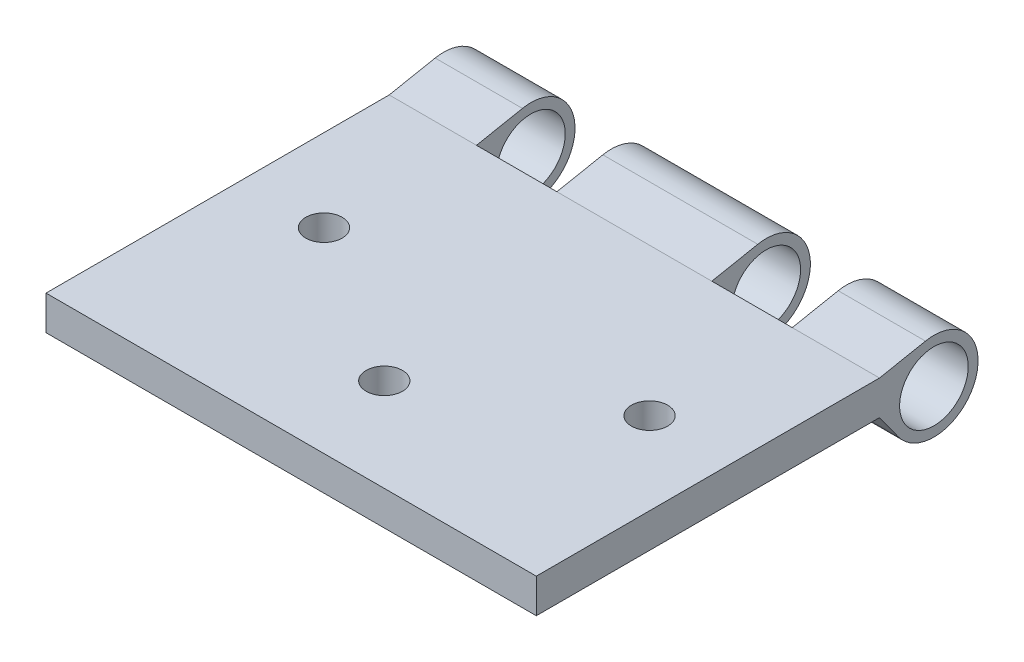
ISO-10303-21;
HEADER;
FILE_DESCRIPTION(('STEP AP214'),'2;1');
FILE_NAME('part.step','',(''),(''),'','','');
FILE_SCHEMA(('AUTOMOTIVE_DESIGN { 1 0 10303 214 1 1 1 1 }'));
ENDSEC;
DATA;
#1=APPLICATION_CONTEXT('core data for automotive mechanical design processes');
#2=APPLICATION_PROTOCOL_DEFINITION('international standard','automotive_design',2000,#1);
#3=PRODUCT_CONTEXT('',#1,'mechanical');
#4=PRODUCT('Part','Part','',(#3));
#5=PRODUCT_RELATED_PRODUCT_CATEGORY('part','',(#4));
#6=PRODUCT_DEFINITION_FORMATION('','',#4);
#7=PRODUCT_DEFINITION_CONTEXT('part definition',#1,'design');
#8=PRODUCT_DEFINITION('design','',#6,#7);
#9=PRODUCT_DEFINITION_SHAPE('','',#8);
#10=(LENGTH_UNIT() NAMED_UNIT(*) SI_UNIT(.MILLI.,.METRE.));
#11=(NAMED_UNIT(*) PLANE_ANGLE_UNIT() SI_UNIT($,.RADIAN.));
#12=(NAMED_UNIT(*) SI_UNIT($,.STERADIAN.) SOLID_ANGLE_UNIT());
#13=UNCERTAINTY_MEASURE_WITH_UNIT(LENGTH_MEASURE(1.E-05),#10,'distance_accuracy_value','');
#14=(GEOMETRIC_REPRESENTATION_CONTEXT(3) GLOBAL_UNCERTAINTY_ASSIGNED_CONTEXT((#13)) GLOBAL_UNIT_ASSIGNED_CONTEXT((#10,
#11,#12)) REPRESENTATION_CONTEXT('',''));
#15=CARTESIAN_POINT('',(0.,0.,0.));
#16=DIRECTION('',(0.,0.,1.));
#17=DIRECTION('',(1.,0.,0.));
#18=AXIS2_PLACEMENT_3D('',#15,#16,#17);
#19=CARTESIAN_POINT('',(25.,0.,-17.5));
#20=DIRECTION('',(0.,0.585308319667777,-0.810810810810811));
#21=DIRECTION('',(0.,0.810810810810811,0.585308319667777));
#22=AXIS2_PLACEMENT_3D('',#19,#20,#21);
#23=PLANE('',#22);
#24=DIRECTION('',(0.,-0.810810810810811,-0.585308319667777));
#25=VECTOR('',#24,1.);
#26=CARTESIAN_POINT('',(-7.9,0.,-17.5));
#27=LINE('',#26,#25);
#28=CARTESIAN_POINT('',(-7.9,0.,-17.5));
#29=VERTEX_POINT('',#28);
#30=CARTESIAN_POINT('',(-7.9,-2.63388743850499,-19.4013513513514));
#31=VERTEX_POINT('',#30);
#32=EDGE_CURVE('E304',#29,#31,#27,.T.);
#33=ORIENTED_EDGE('',*,*,#32,.T.);
#34=DIRECTION('',(-1.,0.,0.));
#35=VECTOR('',#34,1.);
#36=CARTESIAN_POINT('',(25.,-2.63388743850499,-19.4013513513514));
#37=LINE('',#36,#35);
#38=CARTESIAN_POINT('',(7.9,-2.63388743850499,-19.4013513513514));
#39=VERTEX_POINT('',#38);
#40=EDGE_CURVE('E181',#39,#31,#37,.T.);
#41=ORIENTED_EDGE('',*,*,#40,.F.);
#42=DIRECTION('',(0.,-0.810810810810811,-0.585308319667777));
#43=VECTOR('',#42,1.);
#44=CARTESIAN_POINT('',(7.9,0.,-17.5));
#45=LINE('',#44,#43);
#46=CARTESIAN_POINT('',(7.9,0.,-17.5));
#47=VERTEX_POINT('',#46);
#48=EDGE_CURVE('E264',#47,#39,#45,.T.);
#49=ORIENTED_EDGE('',*,*,#48,.F.);
#50=DIRECTION('',(-1.,0.,0.));
#51=VECTOR('',#50,1.);
#52=CARTESIAN_POINT('',(-25.,0.,-17.5));
#53=LINE('',#52,#51);
#54=EDGE_CURVE('E221',#47,#29,#53,.T.);
#55=ORIENTED_EDGE('',*,*,#54,.T.);
#56=EDGE_LOOP('',(#33,#41,#49,#55));
#57=FACE_BOUND('',#56,.T.);
#58=ADVANCED_FACE('F37',(#57),#23,.F.);
#59=CARTESIAN_POINT('',(25.,0.,-23.05));
#60=DIRECTION('',(-1.,0.,0.));
#61=DIRECTION('',(0.,0.,1.));
#62=AXIS2_PLACEMENT_3D('',#59,#60,#61);
#63=CYLINDRICAL_SURFACE('',#62,4.5);
#64=CARTESIAN_POINT('',(-7.9,0.,-23.05));
#65=DIRECTION('',(1.,0.,0.));
#66=DIRECTION('',(0.,0.,-1.));
#67=AXIS2_PLACEMENT_3D('',#64,#65,#66);
#68=CIRCLE('',#67,4.5);
#69=CARTESIAN_POINT('',(-7.9,4.41636440085435,-22.1864460185568));
#70=VERTEX_POINT('',#69);
#71=EDGE_CURVE('E302',#31,#70,#68,.T.);
#72=ORIENTED_EDGE('',*,*,#71,.T.);
#73=DIRECTION('',(-1.,0.,0.));
#74=VECTOR('',#73,1.);
#75=CARTESIAN_POINT('',(25.,4.41636440085435,-22.1864460185568));
#76=LINE('',#75,#74);
#77=CARTESIAN_POINT('',(7.9,4.41636440085435,-22.1864460185568));
#78=VERTEX_POINT('',#77);
#79=EDGE_CURVE('E165',#78,#70,#76,.T.);
#80=ORIENTED_EDGE('',*,*,#79,.F.);
#81=CARTESIAN_POINT('',(7.9,0.,-23.05));
#82=DIRECTION('',(1.,0.,0.));
#83=DIRECTION('',(0.,0.,-1.));
#84=AXIS2_PLACEMENT_3D('',#81,#82,#83);
#85=CIRCLE('',#84,4.5);
#86=EDGE_CURVE('E62',#39,#78,#85,.T.);
#87=ORIENTED_EDGE('',*,*,#86,.F.);
#88=ORIENTED_EDGE('',*,*,#40,.T.);
#89=EDGE_LOOP('',(#72,#80,#87,#88));
#90=FACE_BOUND('',#89,.T.);
#91=ADVANCED_FACE('F314',(#90),#63,.T.);
#92=CARTESIAN_POINT('',(25.,3.5,-17.5));
#93=DIRECTION('',(0.,-0.981414311300966,-0.191900884765156));
#94=DIRECTION('',(0.,0.191900884765156,-0.981414311300967));
#95=AXIS2_PLACEMENT_3D('',#92,#93,#94);
#96=PLANE('',#95);
#97=DIRECTION('',(0.,-0.191900884765156,0.981414311300966));
#98=VECTOR('',#97,1.);
#99=CARTESIAN_POINT('',(-7.9,3.5,-17.5));
#100=LINE('',#99,#98);
#101=CARTESIAN_POINT('',(-7.9,3.5,-17.5));
#102=VERTEX_POINT('',#101);
#103=EDGE_CURVE('E299',#70,#102,#100,.T.);
#104=ORIENTED_EDGE('',*,*,#103,.T.);
#105=DIRECTION('',(-1.,0.,0.));
#106=VECTOR('',#105,1.);
#107=CARTESIAN_POINT('',(-25.,3.5,-17.5));
#108=LINE('',#107,#106);
#109=CARTESIAN_POINT('',(7.9,3.5,-17.5));
#110=VERTEX_POINT('',#109);
#111=EDGE_CURVE('E209',#110,#102,#108,.T.);
#112=ORIENTED_EDGE('',*,*,#111,.F.);
#113=DIRECTION('',(0.,-0.191900884765156,0.981414311300966));
#114=VECTOR('',#113,1.);
#115=CARTESIAN_POINT('',(7.9,3.5,-17.5));
#116=LINE('',#115,#114);
#117=EDGE_CURVE('E239',#78,#110,#116,.T.);
#118=ORIENTED_EDGE('',*,*,#117,.F.);
#119=ORIENTED_EDGE('',*,*,#79,.T.);
#120=EDGE_LOOP('',(#104,#112,#118,#119));
#121=FACE_BOUND('',#120,.T.);
#122=ADVANCED_FACE('F297',(#121),#96,.F.);
#123=CARTESIAN_POINT('',(25.,0.,-23.05));
#124=DIRECTION('',(-1.,0.,0.));
#125=DIRECTION('',(0.,0.,1.));
#126=AXIS2_PLACEMENT_3D('',#123,#124,#125);
#127=CYLINDRICAL_SURFACE('',#126,3.5);
#128=CARTESIAN_POINT('',(7.9,0.,-23.05));
#129=DIRECTION('',(1.,0.,0.));
#130=DIRECTION('',(0.,0.,-1.));
#131=AXIS2_PLACEMENT_3D('',#128,#129,#130);
#132=CIRCLE('',#131,3.5);
#133=CARTESIAN_POINT('',(7.9,0.,-26.55));
#134=VERTEX_POINT('',#133);
#135=EDGE_CURVE('E226',#134,#134,#132,.T.);
#136=ORIENTED_EDGE('',*,*,#135,.T.);
#137=EDGE_LOOP('',(#136));
#138=FACE_BOUND('',#137,.T.);
#139=CARTESIAN_POINT('',(-7.9,0.,-23.05));
#140=DIRECTION('',(-1.,0.,0.));
#141=DIRECTION('',(0.,0.,1.));
#142=AXIS2_PLACEMENT_3D('',#139,#140,#141);
#143=CIRCLE('',#142,3.5);
#144=CARTESIAN_POINT('',(-7.9,0.,-19.55));
#145=VERTEX_POINT('',#144);
#146=EDGE_CURVE('E233',#145,#145,#143,.T.);
#147=ORIENTED_EDGE('',*,*,#146,.T.);
#148=EDGE_LOOP('',(#147));
#149=FACE_BOUND('',#148,.T.);
#150=ADVANCED_FACE('F337',(#138,#149),#127,.F.);
#151=CARTESIAN_POINT('',(-16.1,-2.63388743850499,-19.4013513513514));
#152=VERTEX_POINT('',#151);
#153=CARTESIAN_POINT('',(-25.,-2.63388743850499,-19.4013513513514));
#154=VERTEX_POINT('',#153);
#155=EDGE_CURVE('E176',#152,#154,#37,.T.);
#156=ORIENTED_EDGE('',*,*,#155,.F.);
#157=DIRECTION('',(0.,-0.810810810810811,-0.585308319667777));
#158=VECTOR('',#157,1.);
#159=CARTESIAN_POINT('',(-16.1,0.,-17.5));
#160=LINE('',#159,#158);
#161=CARTESIAN_POINT('',(-16.1,0.,-17.5));
#162=VERTEX_POINT('',#161);
#163=EDGE_CURVE('E147',#162,#152,#160,.T.);
#164=ORIENTED_EDGE('',*,*,#163,.F.);
#165=CARTESIAN_POINT('',(-25.,0.,-17.5));
#166=VERTEX_POINT('',#165);
#167=EDGE_CURVE('E215',#162,#166,#53,.T.);
#168=ORIENTED_EDGE('',*,*,#167,.T.);
#169=DIRECTION('',(0.,-0.810810810810811,-0.585308319667777));
#170=VECTOR('',#169,1.);
#171=CARTESIAN_POINT('',(-25.,0.,-17.5));
#172=LINE('',#171,#170);
#173=EDGE_CURVE('E274',#166,#154,#172,.T.);
#174=ORIENTED_EDGE('',*,*,#173,.T.);
#175=EDGE_LOOP('',(#156,#164,#168,#174));
#176=FACE_BOUND('',#175,.T.);
#177=ADVANCED_FACE('F328',(#176),#23,.F.);
#178=CARTESIAN_POINT('',(-16.1,4.41636440085435,-22.1864460185568));
#179=VERTEX_POINT('',#178);
#180=CARTESIAN_POINT('',(-25.,4.41636440085435,-22.1864460185568));
#181=VERTEX_POINT('',#180);
#182=EDGE_CURVE('E156',#179,#181,#76,.T.);
#183=ORIENTED_EDGE('',*,*,#182,.F.);
#184=CARTESIAN_POINT('',(-16.1,0.,-23.05));
#185=DIRECTION('',(1.,0.,0.));
#186=DIRECTION('',(0.,0.,-1.));
#187=AXIS2_PLACEMENT_3D('',#184,#185,#186);
#188=CIRCLE('',#187,4.5);
#189=EDGE_CURVE('E140',#152,#179,#188,.T.);
#190=ORIENTED_EDGE('',*,*,#189,.F.);
#191=ORIENTED_EDGE('',*,*,#155,.T.);
#192=CARTESIAN_POINT('',(-25.,0.,-23.05));
#193=DIRECTION('',(1.,0.,0.));
#194=DIRECTION('',(0.,0.,-1.));
#195=AXIS2_PLACEMENT_3D('',#192,#193,#194);
#196=CIRCLE('',#195,4.5);
#197=EDGE_CURVE('E163',#154,#181,#196,.T.);
#198=ORIENTED_EDGE('',*,*,#197,.T.);
#199=EDGE_LOOP('',(#183,#190,#191,#198));
#200=FACE_BOUND('',#199,.T.);
#201=ADVANCED_FACE('F161',(#200),#63,.T.);
#202=CARTESIAN_POINT('',(-16.1,3.5,-17.5));
#203=VERTEX_POINT('',#202);
#204=CARTESIAN_POINT('',(-25.,3.5,-17.5));
#205=VERTEX_POINT('',#204);
#206=EDGE_CURVE('E158',#203,#205,#108,.T.);
#207=ORIENTED_EDGE('',*,*,#206,.F.);
#208=DIRECTION('',(0.,-0.191900884765156,0.981414311300966));
#209=VECTOR('',#208,1.);
#210=CARTESIAN_POINT('',(-16.1,3.5,-17.5));
#211=LINE('',#210,#209);
#212=EDGE_CURVE('E144',#179,#203,#211,.T.);
#213=ORIENTED_EDGE('',*,*,#212,.F.);
#214=ORIENTED_EDGE('',*,*,#182,.T.);
#215=DIRECTION('',(0.,-0.191900884765156,0.981414311300966));
#216=VECTOR('',#215,1.);
#217=CARTESIAN_POINT('',(-25.,3.5,-17.5));
#218=LINE('',#217,#216);
#219=EDGE_CURVE('E279',#181,#205,#218,.T.);
#220=ORIENTED_EDGE('',*,*,#219,.T.);
#221=EDGE_LOOP('',(#207,#213,#214,#220));
#222=FACE_BOUND('',#221,.T.);
#223=ADVANCED_FACE('F154',(#222),#96,.F.);
#224=CARTESIAN_POINT('',(-16.1,0.,-23.05));
#225=DIRECTION('',(-1.,0.,0.));
#226=DIRECTION('',(0.,0.,1.));
#227=AXIS2_PLACEMENT_3D('',#224,#225,#226);
#228=CIRCLE('',#227,3.5);
#229=CARTESIAN_POINT('',(-16.1,0.,-19.55));
#230=VERTEX_POINT('',#229);
#231=EDGE_CURVE('E41',#230,#230,#228,.T.);
#232=ORIENTED_EDGE('',*,*,#231,.F.);
#233=EDGE_LOOP('',(#232));
#234=FACE_BOUND('',#233,.T.);
#235=CARTESIAN_POINT('',(-25.,0.,-23.05));
#236=DIRECTION('',(1.,0.,0.));
#237=DIRECTION('',(0.,0.,-1.));
#238=AXIS2_PLACEMENT_3D('',#235,#236,#237);
#239=CIRCLE('',#238,3.5);
#240=CARTESIAN_POINT('',(-25.,0.,-26.55));
#241=VERTEX_POINT('',#240);
#242=EDGE_CURVE('E232',#241,#241,#239,.T.);
#243=ORIENTED_EDGE('',*,*,#242,.F.);
#244=EDGE_LOOP('',(#243));
#245=FACE_BOUND('',#244,.T.);
#246=ADVANCED_FACE('F377',(#234,#245),#127,.F.);
#247=CARTESIAN_POINT('',(25.,3.5,-17.5));
#248=DIRECTION('',(-1.,0.,0.));
#249=DIRECTION('',(0.,0.,1.));
#250=AXIS2_PLACEMENT_3D('',#247,#248,#249);
#251=PLANE('',#250);
#252=DIRECTION('',(0.,0.,-1.));
#253=VECTOR('',#252,1.);
#254=CARTESIAN_POINT('',(25.,0.,-17.5));
#255=LINE('',#254,#253);
#256=CARTESIAN_POINT('',(25.,0.,17.5));
#257=VERTEX_POINT('',#256);
#258=CARTESIAN_POINT('',(25.,0.,-17.5));
#259=VERTEX_POINT('',#258);
#260=EDGE_CURVE('E213',#257,#259,#255,.T.);
#261=ORIENTED_EDGE('',*,*,#260,.T.);
#262=DIRECTION('',(0.,-0.810810810810811,-0.585308319667777));
#263=VECTOR('',#262,1.);
#264=CARTESIAN_POINT('',(25.,0.,-17.5));
#265=LINE('',#264,#263);
#266=CARTESIAN_POINT('',(25.,-2.63388743850499,-19.4013513513514));
#267=VERTEX_POINT('',#266);
#268=EDGE_CURVE('E277',#259,#267,#265,.T.);
#269=ORIENTED_EDGE('',*,*,#268,.T.);
#270=CARTESIAN_POINT('',(25.,0.,-23.05));
#271=DIRECTION('',(1.,0.,0.));
#272=DIRECTION('',(0.,0.,-1.));
#273=AXIS2_PLACEMENT_3D('',#270,#271,#272);
#274=CIRCLE('',#273,4.5);
#275=CARTESIAN_POINT('',(25.,4.41636440085435,-22.1864460185568));
#276=VERTEX_POINT('',#275);
#277=EDGE_CURVE('E171',#267,#276,#274,.T.);
#278=ORIENTED_EDGE('',*,*,#277,.T.);
#279=DIRECTION('',(0.,-0.191900884765156,0.981414311300966));
#280=VECTOR('',#279,1.);
#281=CARTESIAN_POINT('',(25.,3.5,-17.5));
#282=LINE('',#281,#280);
#283=CARTESIAN_POINT('',(25.,3.5,-17.5));
#284=VERTEX_POINT('',#283);
#285=EDGE_CURVE('E166',#276,#284,#282,.T.);
#286=ORIENTED_EDGE('',*,*,#285,.T.);
#287=DIRECTION('',(0.,0.,-1.));
#288=VECTOR('',#287,1.);
#289=CARTESIAN_POINT('',(25.,3.5,-17.5));
#290=LINE('',#289,#288);
#291=CARTESIAN_POINT('',(25.,3.5,17.5));
#292=VERTEX_POINT('',#291);
#293=EDGE_CURVE('E202',#292,#284,#290,.T.);
#294=ORIENTED_EDGE('',*,*,#293,.F.);
#295=DIRECTION('',(0.,-1.,0.));
#296=VECTOR('',#295,1.);
#297=CARTESIAN_POINT('',(25.,3.5,17.5));
#298=LINE('',#297,#296);
#299=EDGE_CURVE('E46',#292,#257,#298,.T.);
#300=ORIENTED_EDGE('',*,*,#299,.T.);
#301=EDGE_LOOP('',(#261,#269,#278,#286,#294,#300));
#302=FACE_BOUND('',#301,.T.);
#303=CARTESIAN_POINT('',(25.,0.,-23.05));
#304=DIRECTION('',(1.,0.,0.));
#305=DIRECTION('',(0.,0.,-1.));
#306=AXIS2_PLACEMENT_3D('',#303,#304,#305);
#307=CIRCLE('',#306,3.5);
#308=CARTESIAN_POINT('',(25.,0.,-26.55));
#309=VERTEX_POINT('',#308);
#310=EDGE_CURVE('E271',#309,#309,#307,.T.);
#311=ORIENTED_EDGE('',*,*,#310,.F.);
#312=EDGE_LOOP('',(#311));
#313=FACE_BOUND('',#312,.T.);
#314=ADVANCED_FACE('F39',(#302,#313),#251,.F.);
#315=CARTESIAN_POINT('',(-25.,3.5,-17.5));
#316=DIRECTION('',(1.,0.,0.));
#317=DIRECTION('',(0.,0.,-1.));
#318=AXIS2_PLACEMENT_3D('',#315,#316,#317);
#319=PLANE('',#318);
#320=DIRECTION('',(0.,0.,1.));
#321=VECTOR('',#320,1.);
#322=CARTESIAN_POINT('',(-25.,0.,-17.5));
#323=LINE('',#322,#321);
#324=CARTESIAN_POINT('',(-25.,0.,17.5));
#325=VERTEX_POINT('',#324);
#326=EDGE_CURVE('E220',#166,#325,#323,.T.);
#327=ORIENTED_EDGE('',*,*,#326,.T.);
#328=DIRECTION('',(0.,-1.,0.));
#329=VECTOR('',#328,1.);
#330=CARTESIAN_POINT('',(-25.,3.5,17.5));
#331=LINE('',#330,#329);
#332=CARTESIAN_POINT('',(-25.,3.5,17.5));
#333=VERTEX_POINT('',#332);
#334=EDGE_CURVE('E11',#333,#325,#331,.T.);
#335=ORIENTED_EDGE('',*,*,#334,.F.);
#336=DIRECTION('',(0.,0.,1.));
#337=VECTOR('',#336,1.);
#338=CARTESIAN_POINT('',(-25.,3.5,-17.5));
#339=LINE('',#338,#337);
#340=EDGE_CURVE('E208',#205,#333,#339,.T.);
#341=ORIENTED_EDGE('',*,*,#340,.F.);
#342=ORIENTED_EDGE('',*,*,#219,.F.);
#343=ORIENTED_EDGE('',*,*,#197,.F.);
#344=ORIENTED_EDGE('',*,*,#173,.F.);
#345=EDGE_LOOP('',(#327,#335,#341,#342,#343,#344));
#346=FACE_BOUND('',#345,.T.);
#347=ORIENTED_EDGE('',*,*,#242,.T.);
#348=EDGE_LOOP('',(#347));
#349=FACE_BOUND('',#348,.T.);
#350=ADVANCED_FACE('F284',(#346,#349),#319,.F.);
#351=CARTESIAN_POINT('',(-25.,3.5,17.5));
#352=DIRECTION('',(0.,0.,-1.));
#353=DIRECTION('',(-1.,0.,0.));
#354=AXIS2_PLACEMENT_3D('',#351,#352,#353);
#355=PLANE('',#354);
#356=DIRECTION('',(1.,0.,0.));
#357=VECTOR('',#356,1.);
#358=CARTESIAN_POINT('',(-25.,0.,17.5));
#359=LINE('',#358,#357);
#360=EDGE_CURVE('E204',#325,#257,#359,.T.);
#361=ORIENTED_EDGE('',*,*,#360,.T.);
#362=ORIENTED_EDGE('',*,*,#299,.F.);
#363=DIRECTION('',(1.,0.,0.));
#364=VECTOR('',#363,1.);
#365=CARTESIAN_POINT('',(-25.,3.5,17.5));
#366=LINE('',#365,#364);
#367=EDGE_CURVE('E211',#333,#292,#366,.T.);
#368=ORIENTED_EDGE('',*,*,#367,.F.);
#369=ORIENTED_EDGE('',*,*,#334,.T.);
#370=EDGE_LOOP('',(#361,#362,#368,#369));
#371=FACE_BOUND('',#370,.T.);
#372=ADVANCED_FACE('F459',(#371),#355,.F.);
#373=CARTESIAN_POINT('',(0.,3.5,0.));
#374=DIRECTION('',(0.,1.,0.));
#375=DIRECTION('',(0.,0.,1.));
#376=AXIS2_PLACEMENT_3D('',#373,#374,#375);
#377=PLANE('',#376);
#378=CARTESIAN_POINT('',(0.,3.5,8.));
#379=DIRECTION('',(0.,1.,0.));
#380=DIRECTION('',(0.,0.,1.));
#381=AXIS2_PLACEMENT_3D('',#378,#379,#380);
#382=CIRCLE('',#381,1.85);
#383=CARTESIAN_POINT('',(0.,3.5,9.85));
#384=VERTEX_POINT('',#383);
#385=EDGE_CURVE('E548',#384,#384,#382,.T.);
#386=ORIENTED_EDGE('',*,*,#385,.F.);
#387=EDGE_LOOP('',(#386));
#388=FACE_BOUND('',#387,.T.);
#389=CARTESIAN_POINT('',(16.6,3.5,-2.45));
#390=DIRECTION('',(0.,1.,0.));
#391=DIRECTION('',(0.,0.,1.));
#392=AXIS2_PLACEMENT_3D('',#389,#390,#391);
#393=CIRCLE('',#392,1.85);
#394=CARTESIAN_POINT('',(16.6,3.5,-0.599999999999999));
#395=VERTEX_POINT('',#394);
#396=EDGE_CURVE('E198',#395,#395,#393,.T.);
#397=ORIENTED_EDGE('',*,*,#396,.F.);
#398=EDGE_LOOP('',(#397));
#399=FACE_BOUND('',#398,.T.);
#400=CARTESIAN_POINT('',(-16.6,3.5,-2.45));
#401=DIRECTION('',(0.,1.,0.));
#402=DIRECTION('',(0.,0.,1.));
#403=AXIS2_PLACEMENT_3D('',#400,#401,#402);
#404=CIRCLE('',#403,1.85);
#405=CARTESIAN_POINT('',(-16.6,3.5,-0.599999999999999));
#406=VERTEX_POINT('',#405);
#407=EDGE_CURVE('E187',#406,#406,#404,.T.);
#408=ORIENTED_EDGE('',*,*,#407,.F.);
#409=EDGE_LOOP('',(#408));
#410=FACE_BOUND('',#409,.T.);
#411=ORIENTED_EDGE('',*,*,#293,.T.);
#412=CARTESIAN_POINT('',(16.1,3.5,-17.5));
#413=VERTEX_POINT('',#412);
#414=EDGE_CURVE('E205',#284,#413,#108,.T.);
#415=ORIENTED_EDGE('',*,*,#414,.T.);
#416=DIRECTION('',(-1.,0.,0.));
#417=VECTOR('',#416,1.);
#418=CARTESIAN_POINT('',(16.1,3.5,-17.5));
#419=LINE('',#418,#417);
#420=EDGE_CURVE('E230',#413,#110,#419,.T.);
#421=ORIENTED_EDGE('',*,*,#420,.T.);
#422=ORIENTED_EDGE('',*,*,#111,.T.);
#423=DIRECTION('',(1.,0.,0.));
#424=VECTOR('',#423,1.);
#425=CARTESIAN_POINT('',(-16.1,3.5,-17.5));
#426=LINE('',#425,#424);
#427=EDGE_CURVE('E241',#203,#102,#426,.T.);
#428=ORIENTED_EDGE('',*,*,#427,.F.);
#429=ORIENTED_EDGE('',*,*,#206,.T.);
#430=ORIENTED_EDGE('',*,*,#340,.T.);
#431=ORIENTED_EDGE('',*,*,#367,.T.);
#432=EDGE_LOOP('',(#411,#415,#421,#422,#428,#429,#430,#431));
#433=FACE_BOUND('',#432,.T.);
#434=ADVANCED_FACE('F290',(#388,#399,#410,#433),#377,.T.);
#435=CARTESIAN_POINT('',(0.,0.,0.));
#436=DIRECTION('',(0.,1.,0.));
#437=DIRECTION('',(0.,0.,1.));
#438=AXIS2_PLACEMENT_3D('',#435,#436,#437);
#439=PLANE('',#438);
#440=CARTESIAN_POINT('',(0.,0.,8.));
#441=DIRECTION('',(0.,1.,0.));
#442=DIRECTION('',(0.,0.,1.));
#443=AXIS2_PLACEMENT_3D('',#440,#441,#442);
#444=CIRCLE('',#443,1.85);
#445=CARTESIAN_POINT('',(0.,0.,9.85));
#446=VERTEX_POINT('',#445);
#447=EDGE_CURVE('E216',#446,#446,#444,.T.);
#448=ORIENTED_EDGE('',*,*,#447,.T.);
#449=EDGE_LOOP('',(#448));
#450=FACE_BOUND('',#449,.T.);
#451=CARTESIAN_POINT('',(16.6,0.,-2.45));
#452=DIRECTION('',(0.,1.,0.));
#453=DIRECTION('',(0.,0.,1.));
#454=AXIS2_PLACEMENT_3D('',#451,#452,#453);
#455=CIRCLE('',#454,1.85);
#456=CARTESIAN_POINT('',(16.6,0.,-0.599999999999999));
#457=VERTEX_POINT('',#456);
#458=EDGE_CURVE('E546',#457,#457,#455,.T.);
#459=ORIENTED_EDGE('',*,*,#458,.T.);
#460=EDGE_LOOP('',(#459));
#461=FACE_BOUND('',#460,.T.);
#462=CARTESIAN_POINT('',(-16.6,0.,-2.45));
#463=DIRECTION('',(0.,1.,0.));
#464=DIRECTION('',(0.,0.,1.));
#465=AXIS2_PLACEMENT_3D('',#462,#463,#464);
#466=CIRCLE('',#465,1.85);
#467=CARTESIAN_POINT('',(-16.6,0.,-0.599999999999999));
#468=VERTEX_POINT('',#467);
#469=EDGE_CURVE('E193',#468,#468,#466,.T.);
#470=ORIENTED_EDGE('',*,*,#469,.T.);
#471=EDGE_LOOP('',(#470));
#472=FACE_BOUND('',#471,.T.);
#473=ORIENTED_EDGE('',*,*,#260,.F.);
#474=ORIENTED_EDGE('',*,*,#360,.F.);
#475=ORIENTED_EDGE('',*,*,#326,.F.);
#476=ORIENTED_EDGE('',*,*,#167,.F.);
#477=DIRECTION('',(1.,0.,0.));
#478=VECTOR('',#477,1.);
#479=CARTESIAN_POINT('',(-16.1,0.,-17.5));
#480=LINE('',#479,#478);
#481=EDGE_CURVE('E235',#162,#29,#480,.T.);
#482=ORIENTED_EDGE('',*,*,#481,.T.);
#483=ORIENTED_EDGE('',*,*,#54,.F.);
#484=DIRECTION('',(-1.,0.,0.));
#485=VECTOR('',#484,1.);
#486=CARTESIAN_POINT('',(16.1,0.,-17.5));
#487=LINE('',#486,#485);
#488=CARTESIAN_POINT('',(16.1,0.,-17.5));
#489=VERTEX_POINT('',#488);
#490=EDGE_CURVE('E260',#489,#47,#487,.T.);
#491=ORIENTED_EDGE('',*,*,#490,.F.);
#492=EDGE_CURVE('E217',#259,#489,#53,.T.);
#493=ORIENTED_EDGE('',*,*,#492,.F.);
#494=EDGE_LOOP('',(#473,#474,#475,#476,#482,#483,#491,#493));
#495=FACE_BOUND('',#494,.T.);
#496=ADVANCED_FACE('F354',(#450,#461,#472,#495),#439,.F.);
#497=CARTESIAN_POINT('',(-16.6,0.,-2.45));
#498=DIRECTION('',(0.,1.,0.));
#499=DIRECTION('',(0.,0.,1.));
#500=AXIS2_PLACEMENT_3D('',#497,#498,#499);
#501=CYLINDRICAL_SURFACE('',#500,1.85);
#502=ORIENTED_EDGE('',*,*,#469,.F.);
#503=EDGE_LOOP('',(#502));
#504=FACE_BOUND('',#503,.T.);
#505=ORIENTED_EDGE('',*,*,#407,.T.);
#506=EDGE_LOOP('',(#505));
#507=FACE_BOUND('',#506,.T.);
#508=ADVANCED_FACE('F484',(#504,#507),#501,.F.);
#509=CARTESIAN_POINT('',(16.6,0.,-2.45));
#510=DIRECTION('',(0.,1.,0.));
#511=DIRECTION('',(0.,0.,1.));
#512=AXIS2_PLACEMENT_3D('',#509,#510,#511);
#513=CYLINDRICAL_SURFACE('',#512,1.85);
#514=ORIENTED_EDGE('',*,*,#458,.F.);
#515=EDGE_LOOP('',(#514));
#516=FACE_BOUND('',#515,.T.);
#517=ORIENTED_EDGE('',*,*,#396,.T.);
#518=EDGE_LOOP('',(#517));
#519=FACE_BOUND('',#518,.T.);
#520=ADVANCED_FACE('F347',(#516,#519),#513,.F.);
#521=CARTESIAN_POINT('',(0.,0.,8.));
#522=DIRECTION('',(0.,1.,0.));
#523=DIRECTION('',(0.,0.,1.));
#524=AXIS2_PLACEMENT_3D('',#521,#522,#523);
#525=CYLINDRICAL_SURFACE('',#524,1.85);
#526=ORIENTED_EDGE('',*,*,#447,.F.);
#527=EDGE_LOOP('',(#526));
#528=FACE_BOUND('',#527,.T.);
#529=ORIENTED_EDGE('',*,*,#385,.T.);
#530=EDGE_LOOP('',(#529));
#531=FACE_BOUND('',#530,.T.);
#532=ADVANCED_FACE('F340',(#528,#531),#525,.F.);
#533=ORIENTED_EDGE('',*,*,#492,.T.);
#534=DIRECTION('',(0.,-0.810810810810811,-0.585308319667777));
#535=VECTOR('',#534,1.);
#536=CARTESIAN_POINT('',(16.1,0.,-17.5));
#537=LINE('',#536,#535);
#538=CARTESIAN_POINT('',(16.1,-2.63388743850499,-19.4013513513514));
#539=VERTEX_POINT('',#538);
#540=EDGE_CURVE('E255',#489,#539,#537,.T.);
#541=ORIENTED_EDGE('',*,*,#540,.T.);
#542=EDGE_CURVE('E182',#267,#539,#37,.T.);
#543=ORIENTED_EDGE('',*,*,#542,.F.);
#544=ORIENTED_EDGE('',*,*,#268,.F.);
#545=EDGE_LOOP('',(#533,#541,#543,#544));
#546=FACE_BOUND('',#545,.T.);
#547=ADVANCED_FACE('F329',(#546),#23,.F.);
#548=ORIENTED_EDGE('',*,*,#542,.T.);
#549=CARTESIAN_POINT('',(16.1,0.,-23.05));
#550=DIRECTION('',(1.,0.,0.));
#551=DIRECTION('',(0.,0.,-1.));
#552=AXIS2_PLACEMENT_3D('',#549,#550,#551);
#553=CIRCLE('',#552,4.5);
#554=CARTESIAN_POINT('',(16.1,4.41636440085435,-22.1864460185568));
#555=VERTEX_POINT('',#554);
#556=EDGE_CURVE('E258',#539,#555,#553,.T.);
#557=ORIENTED_EDGE('',*,*,#556,.T.);
#558=EDGE_CURVE('E168',#276,#555,#76,.T.);
#559=ORIENTED_EDGE('',*,*,#558,.F.);
#560=ORIENTED_EDGE('',*,*,#277,.F.);
#561=EDGE_LOOP('',(#548,#557,#559,#560));
#562=FACE_BOUND('',#561,.T.);
#563=ADVANCED_FACE('F334',(#562),#63,.T.);
#564=ORIENTED_EDGE('',*,*,#558,.T.);
#565=DIRECTION('',(0.,-0.191900884765156,0.981414311300966));
#566=VECTOR('',#565,1.);
#567=CARTESIAN_POINT('',(16.1,3.5,-17.5));
#568=LINE('',#567,#566);
#569=EDGE_CURVE('E251',#555,#413,#568,.T.);
#570=ORIENTED_EDGE('',*,*,#569,.T.);
#571=ORIENTED_EDGE('',*,*,#414,.F.);
#572=ORIENTED_EDGE('',*,*,#285,.F.);
#573=EDGE_LOOP('',(#564,#570,#571,#572));
#574=FACE_BOUND('',#573,.T.);
#575=ADVANCED_FACE('F346',(#574),#96,.F.);
#576=CARTESIAN_POINT('',(16.1,0.,-23.05));
#577=DIRECTION('',(1.,0.,0.));
#578=DIRECTION('',(0.,0.,-1.));
#579=AXIS2_PLACEMENT_3D('',#576,#577,#578);
#580=CIRCLE('',#579,3.5);
#581=CARTESIAN_POINT('',(16.1,0.,-26.55));
#582=VERTEX_POINT('',#581);
#583=EDGE_CURVE('E229',#582,#582,#580,.T.);
#584=ORIENTED_EDGE('',*,*,#583,.F.);
#585=EDGE_LOOP('',(#584));
#586=FACE_BOUND('',#585,.T.);
#587=ORIENTED_EDGE('',*,*,#310,.T.);
#588=EDGE_LOOP('',(#587));
#589=FACE_BOUND('',#588,.T.);
#590=ADVANCED_FACE('F373',(#586,#589),#127,.F.);
#591=CARTESIAN_POINT('',(16.1,3.5,-17.5));
#592=DIRECTION('',(0.,0.,-1.));
#593=DIRECTION('',(-1.,0.,0.));
#594=AXIS2_PLACEMENT_3D('',#591,#592,#593);
#595=PLANE('',#594);
#596=DIRECTION('',(0.,-1.,0.));
#597=VECTOR('',#596,1.);
#598=CARTESIAN_POINT('',(7.9,3.5,-17.5));
#599=LINE('',#598,#597);
#600=EDGE_CURVE('E262',#110,#47,#599,.T.);
#601=ORIENTED_EDGE('',*,*,#600,.F.);
#602=ORIENTED_EDGE('',*,*,#420,.F.);
#603=DIRECTION('',(0.,-1.,0.));
#604=VECTOR('',#603,1.);
#605=CARTESIAN_POINT('',(16.1,3.5,-17.5));
#606=LINE('',#605,#604);
#607=EDGE_CURVE('E253',#413,#489,#606,.T.);
#608=ORIENTED_EDGE('',*,*,#607,.T.);
#609=ORIENTED_EDGE('',*,*,#490,.T.);
#610=EDGE_LOOP('',(#601,#602,#608,#609));
#611=FACE_BOUND('',#610,.T.);
#612=ADVANCED_FACE('F357',(#611),#595,.T.);
#613=CARTESIAN_POINT('',(16.1,0.,-23.05));
#614=DIRECTION('',(1.,0.,0.));
#615=DIRECTION('',(0.,0.,-1.));
#616=AXIS2_PLACEMENT_3D('',#613,#614,#615);
#617=PLANE('',#616);
#618=ORIENTED_EDGE('',*,*,#583,.T.);
#619=EDGE_LOOP('',(#618));
#620=FACE_BOUND('',#619,.T.);
#621=ORIENTED_EDGE('',*,*,#569,.F.);
#622=ORIENTED_EDGE('',*,*,#556,.F.);
#623=ORIENTED_EDGE('',*,*,#540,.F.);
#624=ORIENTED_EDGE('',*,*,#607,.F.);
#625=EDGE_LOOP('',(#621,#622,#623,#624));
#626=FACE_BOUND('',#625,.T.);
#627=ADVANCED_FACE('F360',(#620,#626),#617,.F.);
#628=CARTESIAN_POINT('',(7.9,0.,-23.05));
#629=DIRECTION('',(1.,0.,0.));
#630=DIRECTION('',(0.,0.,-1.));
#631=AXIS2_PLACEMENT_3D('',#628,#629,#630);
#632=PLANE('',#631);
#633=ORIENTED_EDGE('',*,*,#135,.F.);
#634=EDGE_LOOP('',(#633));
#635=FACE_BOUND('',#634,.T.);
#636=ORIENTED_EDGE('',*,*,#117,.T.);
#637=ORIENTED_EDGE('',*,*,#600,.T.);
#638=ORIENTED_EDGE('',*,*,#48,.T.);
#639=ORIENTED_EDGE('',*,*,#86,.T.);
#640=EDGE_LOOP('',(#636,#637,#638,#639));
#641=FACE_BOUND('',#640,.T.);
#642=ADVANCED_FACE('F358',(#635,#641),#632,.T.);
#643=CARTESIAN_POINT('',(-16.1,3.5,-17.5));
#644=DIRECTION('',(0.,0.,1.));
#645=DIRECTION('',(1.,0.,0.));
#646=AXIS2_PLACEMENT_3D('',#643,#644,#645);
#647=PLANE('',#646);
#648=DIRECTION('',(0.,-1.,0.));
#649=VECTOR('',#648,1.);
#650=CARTESIAN_POINT('',(-7.9,3.5,-17.5));
#651=LINE('',#650,#649);
#652=EDGE_CURVE('E54',#102,#29,#651,.T.);
#653=ORIENTED_EDGE('',*,*,#652,.T.);
#654=ORIENTED_EDGE('',*,*,#481,.F.);
#655=DIRECTION('',(0.,-1.,0.));
#656=VECTOR('',#655,1.);
#657=CARTESIAN_POINT('',(-16.1,3.5,-17.5));
#658=LINE('',#657,#656);
#659=EDGE_CURVE('E247',#203,#162,#658,.T.);
#660=ORIENTED_EDGE('',*,*,#659,.F.);
#661=ORIENTED_EDGE('',*,*,#427,.T.);
#662=EDGE_LOOP('',(#653,#654,#660,#661));
#663=FACE_BOUND('',#662,.T.);
#664=ADVANCED_FACE('F322',(#663),#647,.F.);
#665=CARTESIAN_POINT('',(-16.1,0.,-23.05));
#666=DIRECTION('',(-1.,0.,0.));
#667=DIRECTION('',(0.,0.,-1.));
#668=AXIS2_PLACEMENT_3D('',#665,#666,#667);
#669=PLANE('',#668);
#670=ORIENTED_EDGE('',*,*,#231,.T.);
#671=EDGE_LOOP('',(#670));
#672=FACE_BOUND('',#671,.T.);
#673=ORIENTED_EDGE('',*,*,#212,.T.);
#674=ORIENTED_EDGE('',*,*,#659,.T.);
#675=ORIENTED_EDGE('',*,*,#163,.T.);
#676=ORIENTED_EDGE('',*,*,#189,.T.);
#677=EDGE_LOOP('',(#673,#674,#675,#676));
#678=FACE_BOUND('',#677,.T.);
#679=ADVANCED_FACE('F142',(#672,#678),#669,.F.);
#680=CARTESIAN_POINT('',(-7.9,0.,-23.05));
#681=DIRECTION('',(-1.,0.,0.));
#682=DIRECTION('',(0.,0.,-1.));
#683=AXIS2_PLACEMENT_3D('',#680,#681,#682);
#684=PLANE('',#683);
#685=ORIENTED_EDGE('',*,*,#146,.F.);
#686=EDGE_LOOP('',(#685));
#687=FACE_BOUND('',#686,.T.);
#688=ORIENTED_EDGE('',*,*,#103,.F.);
#689=ORIENTED_EDGE('',*,*,#71,.F.);
#690=ORIENTED_EDGE('',*,*,#32,.F.);
#691=ORIENTED_EDGE('',*,*,#652,.F.);
#692=EDGE_LOOP('',(#688,#689,#690,#691));
#693=FACE_BOUND('',#692,.T.);
#694=ADVANCED_FACE('F315',(#687,#693),#684,.T.);
#695=CLOSED_SHELL('',(#58,#91,#122,#150,#177,#201,#223,#246,#314,#350,#372,#434,#496,#508,#520,
#532,#547,#563,#575,#590,#612,#627,#642,#664,#679,#694));
#696=MANIFOLD_SOLID_BREP('B2',#695);
#697=ADVANCED_BREP_SHAPE_REPRESENTATION('',(#18,#696),#14);
#698=SHAPE_DEFINITION_REPRESENTATION(#9,#697);
ENDSEC;
END-ISO-10303-21;
